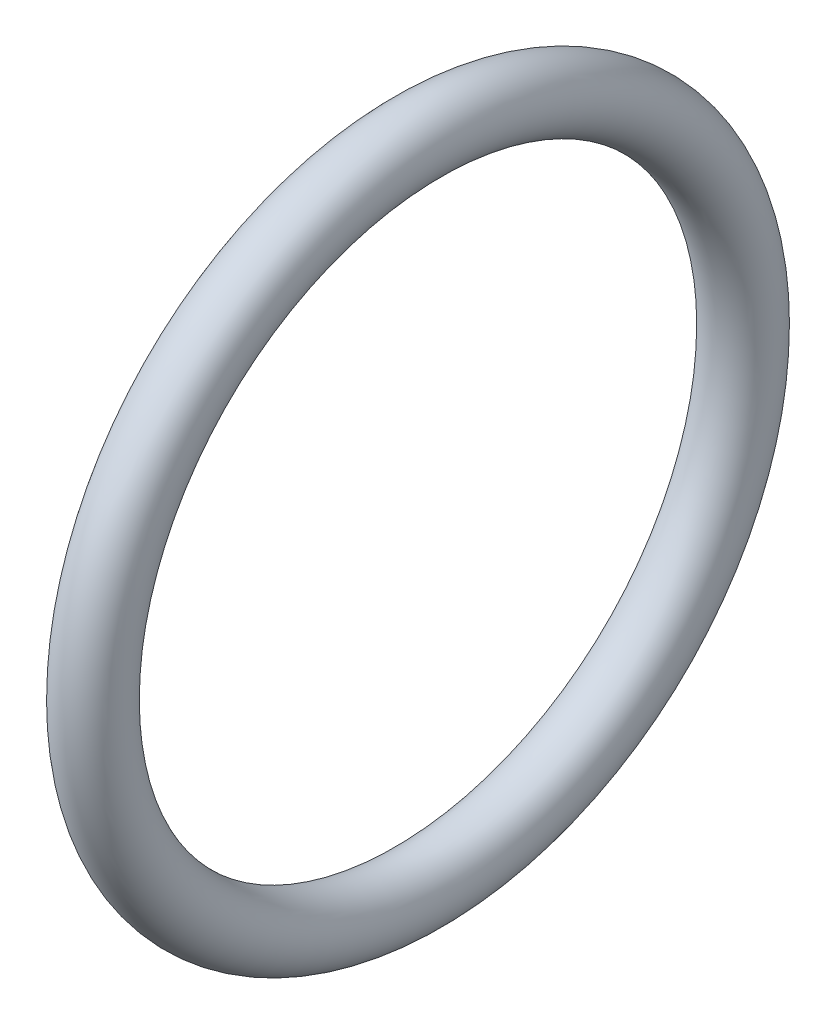
ISO-10303-21;
HEADER;
FILE_DESCRIPTION(('STEP AP214'),'2;1');
FILE_NAME('part.step','',(''),(''),'','','');
FILE_SCHEMA(('AUTOMOTIVE_DESIGN { 1 0 10303 214 1 1 1 1 }'));
ENDSEC;
DATA;
#1=APPLICATION_CONTEXT('core data for automotive mechanical design processes');
#2=APPLICATION_PROTOCOL_DEFINITION('international standard','automotive_design',2000,#1);
#3=PRODUCT_CONTEXT('',#1,'mechanical');
#4=PRODUCT('Part','Part','',(#3));
#5=PRODUCT_RELATED_PRODUCT_CATEGORY('part','',(#4));
#6=PRODUCT_DEFINITION_FORMATION('','',#4);
#7=PRODUCT_DEFINITION_CONTEXT('part definition',#1,'design');
#8=PRODUCT_DEFINITION('design','',#6,#7);
#9=PRODUCT_DEFINITION_SHAPE('','',#8);
#10=(LENGTH_UNIT() NAMED_UNIT(*) SI_UNIT(.MILLI.,.METRE.));
#11=(NAMED_UNIT(*) PLANE_ANGLE_UNIT() SI_UNIT($,.RADIAN.));
#12=(NAMED_UNIT(*) SI_UNIT($,.STERADIAN.) SOLID_ANGLE_UNIT());
#13=UNCERTAINTY_MEASURE_WITH_UNIT(LENGTH_MEASURE(1.E-05),#10,'distance_accuracy_value','');
#14=(GEOMETRIC_REPRESENTATION_CONTEXT(3) GLOBAL_UNCERTAINTY_ASSIGNED_CONTEXT((#13)) GLOBAL_UNIT_ASSIGNED_CONTEXT((#10,
#11,#12)) REPRESENTATION_CONTEXT('',''));
#15=CARTESIAN_POINT('',(0.,0.,0.));
#16=DIRECTION('',(0.,0.,1.));
#17=DIRECTION('',(1.,0.,0.));
#18=AXIS2_PLACEMENT_3D('',#15,#16,#17);
#19=CARTESIAN_POINT('',(1.55,0.,0.));
#20=DIRECTION('',(-1.,0.,0.));
#21=DIRECTION('',(0.,0.,1.));
#22=AXIS2_PLACEMENT_3D('',#19,#20,#21);
#23=TOROIDAL_SURFACE('',#22,5.45,0.55);
#24=CARTESIAN_POINT('',(1.55,0.,6.));
#25=VERTEX_POINT('',#24);
#26=VERTEX_LOOP('',#25);
#27=FACE_BOUND('',#26,.T.);
#28=ADVANCED_FACE('F12',(#27),#23,.T.);
#29=CLOSED_SHELL('',(#28));
#30=MANIFOLD_SOLID_BREP('B1',#29);
#31=ADVANCED_BREP_SHAPE_REPRESENTATION('',(#18,#30),#14);
#32=SHAPE_DEFINITION_REPRESENTATION(#9,#31);
ENDSEC;
END-ISO-10303-21;
